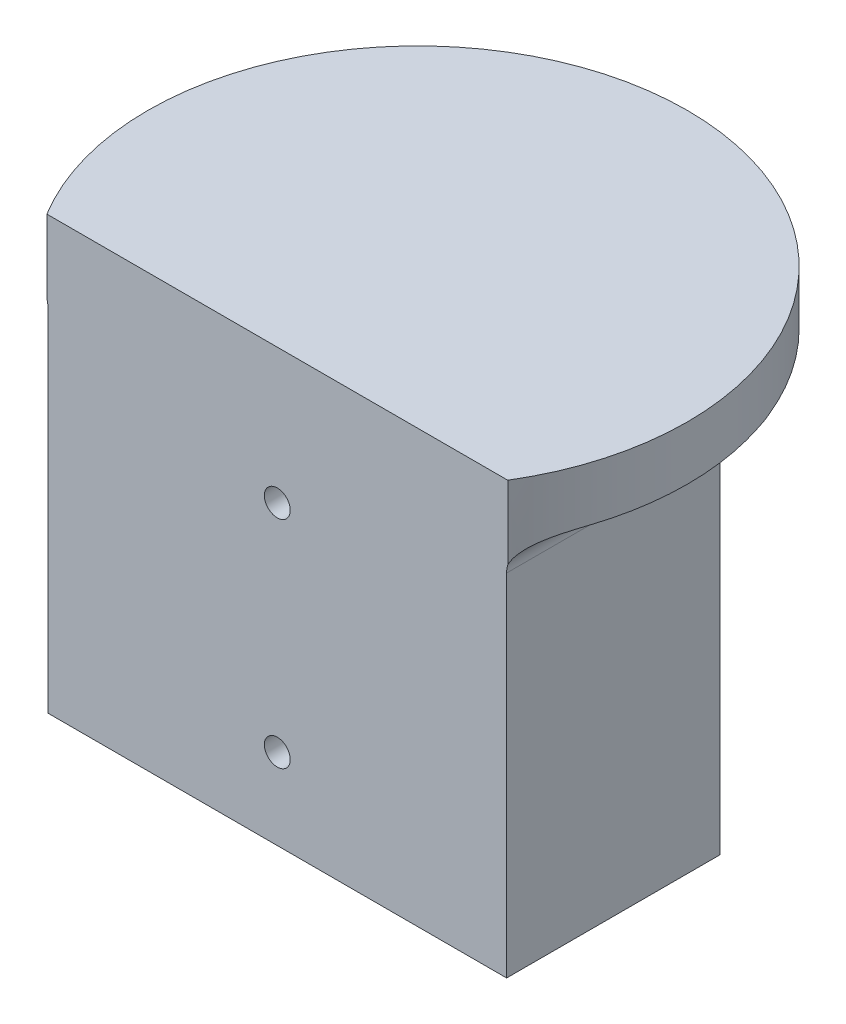
ISO-10303-21;
HEADER;
FILE_DESCRIPTION(('STEP AP214'),'2;1');
FILE_NAME('part.step','',(''),(''),'','','');
FILE_SCHEMA(('AUTOMOTIVE_DESIGN { 1 0 10303 214 1 1 1 1 }'));
ENDSEC;
DATA;
#1=APPLICATION_CONTEXT('core data for automotive mechanical design processes');
#2=APPLICATION_PROTOCOL_DEFINITION('international standard','automotive_design',2000,#1);
#3=PRODUCT_CONTEXT('',#1,'mechanical');
#4=PRODUCT('Part','Part','',(#3));
#5=PRODUCT_RELATED_PRODUCT_CATEGORY('part','',(#4));
#6=PRODUCT_DEFINITION_FORMATION('','',#4);
#7=PRODUCT_DEFINITION_CONTEXT('part definition',#1,'design');
#8=PRODUCT_DEFINITION('design','',#6,#7);
#9=PRODUCT_DEFINITION_SHAPE('','',#8);
#10=(LENGTH_UNIT() NAMED_UNIT(*) SI_UNIT(.MILLI.,.METRE.));
#11=(NAMED_UNIT(*) PLANE_ANGLE_UNIT() SI_UNIT($,.RADIAN.));
#12=(NAMED_UNIT(*) SI_UNIT($,.STERADIAN.) SOLID_ANGLE_UNIT());
#13=UNCERTAINTY_MEASURE_WITH_UNIT(LENGTH_MEASURE(1.E-05),#10,'distance_accuracy_value','');
#14=(GEOMETRIC_REPRESENTATION_CONTEXT(3) GLOBAL_UNCERTAINTY_ASSIGNED_CONTEXT((#13)) GLOBAL_UNIT_ASSIGNED_CONTEXT((#10,
#11,#12)) REPRESENTATION_CONTEXT('',''));
#15=CARTESIAN_POINT('',(0.,0.,0.));
#16=DIRECTION('',(0.,0.,1.));
#17=DIRECTION('',(1.,0.,0.));
#18=AXIS2_PLACEMENT_3D('',#15,#16,#17);
#19=CARTESIAN_POINT('',(0.,70.,0.));
#20=DIRECTION('',(0.,1.,0.));
#21=DIRECTION('',(0.,0.,1.));
#22=AXIS2_PLACEMENT_3D('',#19,#20,#21);
#23=PLANE('',#22);
#24=CARTESIAN_POINT('',(0.,70.,0.));
#25=DIRECTION('',(0.,1.,0.));
#26=DIRECTION('',(0.,0.,1.));
#27=AXIS2_PLACEMENT_3D('',#24,#25,#26);
#28=CIRCLE('',#27,50.);
#29=CARTESIAN_POINT('',(47.5,70.,15.612494995996));
#30=VERTEX_POINT('',#29);
#31=CARTESIAN_POINT('',(47.5,70.,-15.6124949959961));
#32=VERTEX_POINT('',#31);
#33=EDGE_CURVE('E167',#30,#32,#28,.T.);
#34=ORIENTED_EDGE('',*,*,#33,.F.);
#35=DIRECTION('',(0.,0.,-1.));
#36=VECTOR('',#35,1.);
#37=CARTESIAN_POINT('',(47.5,70.,0.));
#38=LINE('',#37,#36);
#39=EDGE_CURVE('E294',#30,#32,#38,.T.);
#40=ORIENTED_EDGE('',*,*,#39,.T.);
#41=EDGE_LOOP('',(#34,#40));
#42=FACE_BOUND('',#41,.T.);
#43=ADVANCED_FACE('F47',(#42),#23,.F.);
#44=CARTESIAN_POINT('',(46.4515877016061,70.,-18.5));
#45=VERTEX_POINT('',#44);
#46=CARTESIAN_POINT('',(-46.4515877016061,70.,-18.5));
#47=VERTEX_POINT('',#46);
#48=EDGE_CURVE('E188',#45,#47,#28,.T.);
#49=ORIENTED_EDGE('',*,*,#48,.F.);
#50=DIRECTION('',(-1.,0.,0.));
#51=VECTOR('',#50,1.);
#52=CARTESIAN_POINT('',(0.,70.,-18.5));
#53=LINE('',#52,#51);
#54=CARTESIAN_POINT('',(27.5,70.,-18.5));
#55=VERTEX_POINT('',#54);
#56=EDGE_CURVE('E291',#45,#55,#53,.T.);
#57=ORIENTED_EDGE('',*,*,#56,.T.);
#58=DIRECTION('',(0.,0.,1.));
#59=VECTOR('',#58,1.);
#60=CARTESIAN_POINT('',(27.5,70.,16.));
#61=LINE('',#60,#59);
#62=CARTESIAN_POINT('',(27.5,70.,11.));
#63=VERTEX_POINT('',#62);
#64=EDGE_CURVE('E288',#55,#63,#61,.T.);
#65=ORIENTED_EDGE('',*,*,#64,.T.);
#66=DIRECTION('',(-1.,0.,0.));
#67=VECTOR('',#66,1.);
#68=CARTESIAN_POINT('',(0.,70.,11.));
#69=LINE('',#68,#67);
#70=CARTESIAN_POINT('',(-27.5,70.,11.));
#71=VERTEX_POINT('',#70);
#72=EDGE_CURVE('E285',#63,#71,#69,.T.);
#73=ORIENTED_EDGE('',*,*,#72,.T.);
#74=DIRECTION('',(0.,0.,-1.));
#75=VECTOR('',#74,1.);
#76=CARTESIAN_POINT('',(-27.5,70.,0.));
#77=LINE('',#76,#75);
#78=CARTESIAN_POINT('',(-27.5,70.,-18.5));
#79=VERTEX_POINT('',#78);
#80=EDGE_CURVE('E282',#71,#79,#77,.T.);
#81=ORIENTED_EDGE('',*,*,#80,.T.);
#82=DIRECTION('',(-1.,0.,0.));
#83=VECTOR('',#82,1.);
#84=CARTESIAN_POINT('',(0.,70.,-18.5));
#85=LINE('',#84,#83);
#86=EDGE_CURVE('E279',#79,#47,#85,.T.);
#87=ORIENTED_EDGE('',*,*,#86,.T.);
#88=EDGE_LOOP('',(#49,#57,#65,#73,#81,#87));
#89=FACE_BOUND('',#88,.T.);
#90=ADVANCED_FACE('F393',(#89),#23,.F.);
#91=CARTESIAN_POINT('',(-32.5,10.,0.));
#92=DIRECTION('',(1.,0.,0.));
#93=DIRECTION('',(0.,0.,-1.));
#94=AXIS2_PLACEMENT_3D('',#91,#92,#93);
#95=PLANE('',#94);
#96=DIRECTION('',(0.,-1.,0.));
#97=VECTOR('',#96,1.);
#98=CARTESIAN_POINT('',(-32.5,10.,-13.5));
#99=LINE('',#98,#97);
#100=CARTESIAN_POINT('',(-32.5,65.,-13.5));
#101=VERTEX_POINT('',#100);
#102=CARTESIAN_POINT('',(-32.5,0.,-13.5));
#103=VERTEX_POINT('',#102);
#104=EDGE_CURVE('E273',#101,#103,#99,.T.);
#105=ORIENTED_EDGE('',*,*,#104,.F.);
#106=DIRECTION('',(0.,0.,-1.));
#107=VECTOR('',#106,1.);
#108=CARTESIAN_POINT('',(-32.5,65.,0.));
#109=LINE('',#108,#107);
#110=CARTESIAN_POINT('',(-32.5,65.,16.));
#111=VERTEX_POINT('',#110);
#112=EDGE_CURVE('E310',#101,#111,#109,.F.);
#113=ORIENTED_EDGE('',*,*,#112,.T.);
#114=DIRECTION('',(0.,-1.,0.));
#115=VECTOR('',#114,1.);
#116=CARTESIAN_POINT('',(-32.5,10.,16.));
#117=LINE('',#116,#115);
#118=CARTESIAN_POINT('',(-32.5,0.,16.));
#119=VERTEX_POINT('',#118);
#120=EDGE_CURVE('E252',#111,#119,#117,.T.);
#121=ORIENTED_EDGE('',*,*,#120,.T.);
#122=DIRECTION('',(0.,0.,1.));
#123=VECTOR('',#122,1.);
#124=CARTESIAN_POINT('',(-32.5,0.,0.));
#125=LINE('',#124,#123);
#126=EDGE_CURVE('E213',#103,#119,#125,.T.);
#127=ORIENTED_EDGE('',*,*,#126,.F.);
#128=EDGE_LOOP('',(#105,#113,#121,#127));
#129=FACE_BOUND('',#128,.T.);
#130=ADVANCED_FACE('F400',(#129),#95,.T.);
#131=CARTESIAN_POINT('',(0.,10.,-13.5));
#132=DIRECTION('',(0.,0.,-1.));
#133=DIRECTION('',(-1.,0.,0.));
#134=AXIS2_PLACEMENT_3D('',#131,#132,#133);
#135=PLANE('',#134);
#136=DIRECTION('',(0.,-1.,0.));
#137=VECTOR('',#136,1.);
#138=CARTESIAN_POINT('',(-42.5,10.,-13.5));
#139=LINE('',#138,#137);
#140=CARTESIAN_POINT('',(-42.5,65.,-13.5));
#141=VERTEX_POINT('',#140);
#142=CARTESIAN_POINT('',(-42.5,0.,-13.5));
#143=VERTEX_POINT('',#142);
#144=EDGE_CURVE('E270',#141,#143,#139,.T.);
#145=ORIENTED_EDGE('',*,*,#144,.F.);
#146=DIRECTION('',(-1.,0.,0.));
#147=VECTOR('',#146,1.);
#148=CARTESIAN_POINT('',(0.,65.,-13.5));
#149=LINE('',#148,#147);
#150=EDGE_CURVE('E313',#141,#101,#149,.F.);
#151=ORIENTED_EDGE('',*,*,#150,.T.);
#152=ORIENTED_EDGE('',*,*,#104,.T.);
#153=DIRECTION('',(1.,0.,0.));
#154=VECTOR('',#153,1.);
#155=CARTESIAN_POINT('',(0.,0.,-13.5));
#156=LINE('',#155,#154);
#157=EDGE_CURVE('E217',#143,#103,#156,.T.);
#158=ORIENTED_EDGE('',*,*,#157,.F.);
#159=EDGE_LOOP('',(#145,#151,#152,#158));
#160=FACE_BOUND('',#159,.T.);
#161=ADVANCED_FACE('F463',(#160),#135,.T.);
#162=CARTESIAN_POINT('',(-42.5,10.,0.));
#163=DIRECTION('',(1.,0.,0.));
#164=DIRECTION('',(0.,0.,-1.));
#165=AXIS2_PLACEMENT_3D('',#162,#163,#164);
#166=PLANE('',#165);
#167=DIRECTION('',(0.,-1.,0.));
#168=VECTOR('',#167,1.);
#169=CARTESIAN_POINT('',(-42.5,10.,26.));
#170=LINE('',#169,#168);
#171=CARTESIAN_POINT('',(-42.5,65.,26.));
#172=VERTEX_POINT('',#171);
#173=CARTESIAN_POINT('',(-42.5,0.,26.));
#174=VERTEX_POINT('',#173);
#175=EDGE_CURVE('E267',#172,#174,#170,.T.);
#176=ORIENTED_EDGE('',*,*,#175,.F.);
#177=DIRECTION('',(0.,0.,1.));
#178=VECTOR('',#177,1.);
#179=CARTESIAN_POINT('',(-42.5,65.,-13.5));
#180=LINE('',#179,#178);
#181=EDGE_CURVE('E316',#172,#141,#180,.F.);
#182=ORIENTED_EDGE('',*,*,#181,.T.);
#183=ORIENTED_EDGE('',*,*,#144,.T.);
#184=DIRECTION('',(0.,0.,1.));
#185=VECTOR('',#184,1.);
#186=CARTESIAN_POINT('',(-42.5,0.,0.));
#187=LINE('',#186,#185);
#188=EDGE_CURVE('E221',#143,#174,#187,.T.);
#189=ORIENTED_EDGE('',*,*,#188,.T.);
#190=EDGE_LOOP('',(#176,#182,#183,#189));
#191=FACE_BOUND('',#190,.T.);
#192=ADVANCED_FACE('F459',(#191),#166,.F.);
#193=CARTESIAN_POINT('',(0.,10.,26.));
#194=DIRECTION('',(0.,0.,-1.));
#195=DIRECTION('',(-1.,0.,0.));
#196=AXIS2_PLACEMENT_3D('',#193,#194,#195);
#197=PLANE('',#196);
#198=CARTESIAN_POINT('',(0.,55.,26.));
#199=DIRECTION('',(0.,0.,-1.));
#200=DIRECTION('',(-1.,0.,0.));
#201=AXIS2_PLACEMENT_3D('',#198,#199,#200);
#202=CIRCLE('',#201,2.4);
#203=CARTESIAN_POINT('',(-2.4,55.,26.));
#204=VERTEX_POINT('',#203);
#205=EDGE_CURVE('E808',#204,#204,#202,.T.);
#206=ORIENTED_EDGE('',*,*,#205,.T.);
#207=EDGE_LOOP('',(#206));
#208=FACE_BOUND('',#207,.T.);
#209=CARTESIAN_POINT('',(0.,15.,26.));
#210=DIRECTION('',(0.,0.,-1.));
#211=DIRECTION('',(-1.,0.,0.));
#212=AXIS2_PLACEMENT_3D('',#209,#210,#211);
#213=CIRCLE('',#212,2.4);
#214=CARTESIAN_POINT('',(-2.4,15.,26.));
#215=VERTEX_POINT('',#214);
#216=EDGE_CURVE('E437',#215,#215,#213,.T.);
#217=ORIENTED_EDGE('',*,*,#216,.T.);
#218=EDGE_LOOP('',(#217));
#219=FACE_BOUND('',#218,.T.);
#220=DIRECTION('',(1.,0.,0.));
#221=VECTOR('',#220,1.);
#222=CARTESIAN_POINT('',(0.,0.,26.));
#223=LINE('',#222,#221);
#224=CARTESIAN_POINT('',(42.5,0.,26.));
#225=VERTEX_POINT('',#224);
#226=EDGE_CURVE('E225',#174,#225,#223,.T.);
#227=ORIENTED_EDGE('',*,*,#226,.T.);
#228=DIRECTION('',(0.,-1.,0.));
#229=VECTOR('',#228,1.);
#230=CARTESIAN_POINT('',(42.5,10.,26.));
#231=LINE('',#230,#229);
#232=CARTESIAN_POINT('',(42.5,65.,26.));
#233=VERTEX_POINT('',#232);
#234=EDGE_CURVE('E264',#233,#225,#231,.T.);
#235=ORIENTED_EDGE('',*,*,#234,.F.);
#236=CARTESIAN_POINT('',(47.5,65.,26.));
#237=DIRECTION('',(0.,0.,-1.));
#238=DIRECTION('',(-1.,0.,0.));
#239=AXIS2_PLACEMENT_3D('',#236,#237,#238);
#240=CIRCLE('',#239,5.);
#241=CARTESIAN_POINT('',(42.7083130081252,66.428193184376,26.));
#242=VERTEX_POINT('',#241);
#243=EDGE_CURVE('E173',#233,#242,#240,.T.);
#244=ORIENTED_EDGE('',*,*,#243,.T.);
#245=DIRECTION('',(0.,-1.,0.));
#246=VECTOR('',#245,1.);
#247=CARTESIAN_POINT('',(42.7083130081252,80.,26.));
#248=LINE('',#247,#246);
#249=CARTESIAN_POINT('',(42.7083130081252,80.,26.));
#250=VERTEX_POINT('',#249);
#251=EDGE_CURVE('E74',#250,#242,#248,.T.);
#252=ORIENTED_EDGE('',*,*,#251,.F.);
#253=DIRECTION('',(1.,0.,0.));
#254=VECTOR('',#253,1.);
#255=CARTESIAN_POINT('',(-42.5,80.,26.));
#256=LINE('',#255,#254);
#257=CARTESIAN_POINT('',(-42.7083130081252,80.,26.));
#258=VERTEX_POINT('',#257);
#259=EDGE_CURVE('E163',#258,#250,#256,.T.);
#260=ORIENTED_EDGE('',*,*,#259,.F.);
#261=DIRECTION('',(0.,-1.,0.));
#262=VECTOR('',#261,1.);
#263=CARTESIAN_POINT('',(-42.7083130081252,80.,26.));
#264=LINE('',#263,#262);
#265=CARTESIAN_POINT('',(-42.7083130081252,66.4281931843761,26.));
#266=VERTEX_POINT('',#265);
#267=EDGE_CURVE('E66',#258,#266,#264,.T.);
#268=ORIENTED_EDGE('',*,*,#267,.T.);
#269=CARTESIAN_POINT('',(-47.5,65.,26.));
#270=DIRECTION('',(0.,0.,-1.));
#271=DIRECTION('',(-1.,0.,0.));
#272=AXIS2_PLACEMENT_3D('',#269,#270,#271);
#273=CIRCLE('',#272,5.);
#274=EDGE_CURVE('E58',#266,#172,#273,.T.);
#275=ORIENTED_EDGE('',*,*,#274,.T.);
#276=ORIENTED_EDGE('',*,*,#175,.T.);
#277=EDGE_LOOP('',(#227,#235,#244,#252,#260,#268,#275,#276));
#278=FACE_BOUND('',#277,.T.);
#279=ADVANCED_FACE('F170',(#208,#219,#278),#197,.F.);
#280=CARTESIAN_POINT('',(42.5,10.,0.));
#281=DIRECTION('',(1.,0.,0.));
#282=DIRECTION('',(0.,0.,-1.));
#283=AXIS2_PLACEMENT_3D('',#280,#281,#282);
#284=PLANE('',#283);
#285=DIRECTION('',(0.,-1.,0.));
#286=VECTOR('',#285,1.);
#287=CARTESIAN_POINT('',(42.5,10.,-13.5));
#288=LINE('',#287,#286);
#289=CARTESIAN_POINT('',(42.5,65.,-13.5));
#290=VERTEX_POINT('',#289);
#291=CARTESIAN_POINT('',(42.5,0.,-13.5));
#292=VERTEX_POINT('',#291);
#293=EDGE_CURVE('E261',#290,#292,#288,.T.);
#294=ORIENTED_EDGE('',*,*,#293,.F.);
#295=DIRECTION('',(0.,0.,-1.));
#296=VECTOR('',#295,1.);
#297=CARTESIAN_POINT('',(42.5,65.,0.));
#298=LINE('',#297,#296);
#299=EDGE_CURVE('E298',#290,#233,#298,.F.);
#300=ORIENTED_EDGE('',*,*,#299,.T.);
#301=ORIENTED_EDGE('',*,*,#234,.T.);
#302=DIRECTION('',(0.,0.,1.));
#303=VECTOR('',#302,1.);
#304=CARTESIAN_POINT('',(42.5,0.,0.));
#305=LINE('',#304,#303);
#306=EDGE_CURVE('E228',#292,#225,#305,.T.);
#307=ORIENTED_EDGE('',*,*,#306,.F.);
#308=EDGE_LOOP('',(#294,#300,#301,#307));
#309=FACE_BOUND('',#308,.T.);
#310=ADVANCED_FACE('F504',(#309),#284,.T.);
#311=CARTESIAN_POINT('',(0.,10.,-13.5));
#312=DIRECTION('',(0.,0.,-1.));
#313=DIRECTION('',(-1.,0.,0.));
#314=AXIS2_PLACEMENT_3D('',#311,#312,#313);
#315=PLANE('',#314);
#316=DIRECTION('',(0.,-1.,0.));
#317=VECTOR('',#316,1.);
#318=CARTESIAN_POINT('',(32.5,10.,-13.5));
#319=LINE('',#318,#317);
#320=CARTESIAN_POINT('',(32.5,65.,-13.5));
#321=VERTEX_POINT('',#320);
#322=CARTESIAN_POINT('',(32.5,0.,-13.5));
#323=VERTEX_POINT('',#322);
#324=EDGE_CURVE('E258',#321,#323,#319,.T.);
#325=ORIENTED_EDGE('',*,*,#324,.F.);
#326=DIRECTION('',(-1.,0.,0.));
#327=VECTOR('',#326,1.);
#328=CARTESIAN_POINT('',(0.,65.,-13.5));
#329=LINE('',#328,#327);
#330=EDGE_CURVE('E301',#321,#290,#329,.F.);
#331=ORIENTED_EDGE('',*,*,#330,.T.);
#332=ORIENTED_EDGE('',*,*,#293,.T.);
#333=DIRECTION('',(1.,0.,0.));
#334=VECTOR('',#333,1.);
#335=CARTESIAN_POINT('',(0.,0.,-13.5));
#336=LINE('',#335,#334);
#337=EDGE_CURVE('E232',#323,#292,#336,.T.);
#338=ORIENTED_EDGE('',*,*,#337,.F.);
#339=EDGE_LOOP('',(#325,#331,#332,#338));
#340=FACE_BOUND('',#339,.T.);
#341=ADVANCED_FACE('F502',(#340),#315,.T.);
#342=CARTESIAN_POINT('',(32.5,10.,0.));
#343=DIRECTION('',(1.,0.,0.));
#344=DIRECTION('',(0.,0.,-1.));
#345=AXIS2_PLACEMENT_3D('',#342,#343,#344);
#346=PLANE('',#345);
#347=DIRECTION('',(0.,-1.,0.));
#348=VECTOR('',#347,1.);
#349=CARTESIAN_POINT('',(32.5,10.,16.));
#350=LINE('',#349,#348);
#351=CARTESIAN_POINT('',(32.5,65.,16.));
#352=VERTEX_POINT('',#351);
#353=CARTESIAN_POINT('',(32.5,0.,16.));
#354=VERTEX_POINT('',#353);
#355=EDGE_CURVE('E255',#352,#354,#350,.T.);
#356=ORIENTED_EDGE('',*,*,#355,.F.);
#357=DIRECTION('',(0.,0.,1.));
#358=VECTOR('',#357,1.);
#359=CARTESIAN_POINT('',(32.5,65.,-13.5));
#360=LINE('',#359,#358);
#361=EDGE_CURVE('E304',#352,#321,#360,.F.);
#362=ORIENTED_EDGE('',*,*,#361,.T.);
#363=ORIENTED_EDGE('',*,*,#324,.T.);
#364=DIRECTION('',(0.,0.,1.));
#365=VECTOR('',#364,1.);
#366=CARTESIAN_POINT('',(32.5,0.,0.));
#367=LINE('',#366,#365);
#368=EDGE_CURVE('E236',#323,#354,#367,.T.);
#369=ORIENTED_EDGE('',*,*,#368,.T.);
#370=EDGE_LOOP('',(#356,#362,#363,#369));
#371=FACE_BOUND('',#370,.T.);
#372=ADVANCED_FACE('F511',(#371),#346,.F.);
#373=CARTESIAN_POINT('',(37.5,10.,8.5));
#374=DIRECTION('',(0.,-1.,0.));
#375=DIRECTION('',(0.,0.,-1.));
#376=AXIS2_PLACEMENT_3D('',#373,#374,#375);
#377=CYLINDRICAL_SURFACE('',#376,2.75);
#378=CARTESIAN_POINT('',(37.5,10.,8.5));
#379=DIRECTION('',(0.,1.,0.));
#380=DIRECTION('',(0.,0.,1.));
#381=AXIS2_PLACEMENT_3D('',#378,#379,#380);
#382=CIRCLE('',#381,2.75);
#383=CARTESIAN_POINT('',(37.5,10.,11.25));
#384=VERTEX_POINT('',#383);
#385=EDGE_CURVE('E199',#384,#384,#382,.T.);
#386=ORIENTED_EDGE('',*,*,#385,.T.);
#387=EDGE_LOOP('',(#386));
#388=FACE_BOUND('',#387,.T.);
#389=CARTESIAN_POINT('',(37.5,0.,8.5));
#390=DIRECTION('',(0.,1.,0.));
#391=DIRECTION('',(0.,0.,1.));
#392=AXIS2_PLACEMENT_3D('',#389,#390,#391);
#393=CIRCLE('',#392,2.75);
#394=CARTESIAN_POINT('',(37.5,0.,11.25));
#395=VERTEX_POINT('',#394);
#396=EDGE_CURVE('E244',#395,#395,#393,.T.);
#397=ORIENTED_EDGE('',*,*,#396,.F.);
#398=EDGE_LOOP('',(#397));
#399=FACE_BOUND('',#398,.T.);
#400=ADVANCED_FACE('F532',(#388,#399),#377,.F.);
#401=CARTESIAN_POINT('',(0.,10.,16.));
#402=DIRECTION('',(0.,0.,-1.));
#403=DIRECTION('',(-1.,0.,0.));
#404=AXIS2_PLACEMENT_3D('',#401,#402,#403);
#405=PLANE('',#404);
#406=CARTESIAN_POINT('',(0.,55.,16.));
#407=DIRECTION('',(0.,0.,-1.));
#408=DIRECTION('',(-1.,0.,0.));
#409=AXIS2_PLACEMENT_3D('',#406,#407,#408);
#410=CIRCLE('',#409,3.99999999999999);
#411=CARTESIAN_POINT('',(-3.99999999999999,55.,16.));
#412=VERTEX_POINT('',#411);
#413=EDGE_CURVE('E798',#412,#412,#410,.T.);
#414=ORIENTED_EDGE('',*,*,#413,.F.);
#415=EDGE_LOOP('',(#414));
#416=FACE_BOUND('',#415,.T.);
#417=CARTESIAN_POINT('',(0.,15.,16.));
#418=DIRECTION('',(0.,0.,-1.));
#419=DIRECTION('',(-1.,0.,0.));
#420=AXIS2_PLACEMENT_3D('',#417,#418,#419);
#421=CIRCLE('',#420,3.99999999999999);
#422=CARTESIAN_POINT('',(-3.99999999999999,15.,16.));
#423=VERTEX_POINT('',#422);
#424=EDGE_CURVE('E812',#423,#423,#421,.T.);
#425=ORIENTED_EDGE('',*,*,#424,.F.);
#426=EDGE_LOOP('',(#425));
#427=FACE_BOUND('',#426,.T.);
#428=ORIENTED_EDGE('',*,*,#120,.F.);
#429=DIRECTION('',(-1.,0.,0.));
#430=VECTOR('',#429,1.);
#431=CARTESIAN_POINT('',(0.,65.,16.));
#432=LINE('',#431,#430);
#433=EDGE_CURVE('E307',#111,#352,#432,.F.);
#434=ORIENTED_EDGE('',*,*,#433,.T.);
#435=ORIENTED_EDGE('',*,*,#355,.T.);
#436=DIRECTION('',(1.,0.,0.));
#437=VECTOR('',#436,1.);
#438=CARTESIAN_POINT('',(0.,0.,16.));
#439=LINE('',#438,#437);
#440=EDGE_CURVE('E240',#119,#354,#439,.T.);
#441=ORIENTED_EDGE('',*,*,#440,.F.);
#442=EDGE_LOOP('',(#428,#434,#435,#441));
#443=FACE_BOUND('',#442,.T.);
#444=ADVANCED_FACE('F495',(#416,#427,#443),#405,.T.);
#445=CARTESIAN_POINT('',(-37.5,10.,-8.5));
#446=DIRECTION('',(0.,-1.,0.));
#447=DIRECTION('',(0.,0.,-1.));
#448=AXIS2_PLACEMENT_3D('',#445,#446,#447);
#449=CYLINDRICAL_SURFACE('',#448,2.75);
#450=CARTESIAN_POINT('',(-37.5,10.,-8.5));
#451=DIRECTION('',(0.,1.,0.));
#452=DIRECTION('',(0.,0.,1.));
#453=AXIS2_PLACEMENT_3D('',#450,#451,#452);
#454=CIRCLE('',#453,2.75);
#455=CARTESIAN_POINT('',(-37.5,10.,-5.75));
#456=VERTEX_POINT('',#455);
#457=EDGE_CURVE('E195',#456,#456,#454,.T.);
#458=ORIENTED_EDGE('',*,*,#457,.T.);
#459=EDGE_LOOP('',(#458));
#460=FACE_BOUND('',#459,.T.);
#461=CARTESIAN_POINT('',(-37.5,0.,-8.5));
#462=DIRECTION('',(0.,1.,0.));
#463=DIRECTION('',(0.,0.,1.));
#464=AXIS2_PLACEMENT_3D('',#461,#462,#463);
#465=CIRCLE('',#464,2.75);
#466=CARTESIAN_POINT('',(-37.5,0.,-5.75));
#467=VERTEX_POINT('',#466);
#468=EDGE_CURVE('E209',#467,#467,#465,.T.);
#469=ORIENTED_EDGE('',*,*,#468,.F.);
#470=EDGE_LOOP('',(#469));
#471=FACE_BOUND('',#470,.T.);
#472=ADVANCED_FACE('F522',(#460,#471),#449,.F.);
#473=CARTESIAN_POINT('',(-37.5,10.,8.5));
#474=DIRECTION('',(0.,-1.,0.));
#475=DIRECTION('',(0.,0.,-1.));
#476=AXIS2_PLACEMENT_3D('',#473,#474,#475);
#477=CYLINDRICAL_SURFACE('',#476,2.75);
#478=CARTESIAN_POINT('',(-37.5,10.,8.5));
#479=DIRECTION('',(0.,1.,0.));
#480=DIRECTION('',(0.,0.,1.));
#481=AXIS2_PLACEMENT_3D('',#478,#479,#480);
#482=CIRCLE('',#481,2.75);
#483=CARTESIAN_POINT('',(-37.5,10.,11.25));
#484=VERTEX_POINT('',#483);
#485=EDGE_CURVE('E190',#484,#484,#482,.T.);
#486=ORIENTED_EDGE('',*,*,#485,.T.);
#487=EDGE_LOOP('',(#486));
#488=FACE_BOUND('',#487,.T.);
#489=CARTESIAN_POINT('',(-37.5,0.,8.5));
#490=DIRECTION('',(0.,1.,0.));
#491=DIRECTION('',(0.,0.,1.));
#492=AXIS2_PLACEMENT_3D('',#489,#490,#491);
#493=CIRCLE('',#492,2.75);
#494=CARTESIAN_POINT('',(-37.5,0.,11.25));
#495=VERTEX_POINT('',#494);
#496=EDGE_CURVE('E194',#495,#495,#493,.T.);
#497=ORIENTED_EDGE('',*,*,#496,.F.);
#498=EDGE_LOOP('',(#497));
#499=FACE_BOUND('',#498,.T.);
#500=ADVANCED_FACE('F340',(#488,#499),#477,.F.);
#501=CARTESIAN_POINT('',(37.5,10.,-8.5));
#502=DIRECTION('',(0.,-1.,0.));
#503=DIRECTION('',(0.,0.,-1.));
#504=AXIS2_PLACEMENT_3D('',#501,#502,#503);
#505=CYLINDRICAL_SURFACE('',#504,2.75);
#506=CARTESIAN_POINT('',(37.5,10.,-8.5));
#507=DIRECTION('',(0.,1.,0.));
#508=DIRECTION('',(0.,0.,1.));
#509=AXIS2_PLACEMENT_3D('',#506,#507,#508);
#510=CIRCLE('',#509,2.75);
#511=CARTESIAN_POINT('',(37.5,10.,-5.75));
#512=VERTEX_POINT('',#511);
#513=EDGE_CURVE('E176',#512,#512,#510,.T.);
#514=ORIENTED_EDGE('',*,*,#513,.T.);
#515=EDGE_LOOP('',(#514));
#516=FACE_BOUND('',#515,.T.);
#517=CARTESIAN_POINT('',(37.5,0.,-8.5));
#518=DIRECTION('',(0.,1.,0.));
#519=DIRECTION('',(0.,0.,1.));
#520=AXIS2_PLACEMENT_3D('',#517,#518,#519);
#521=CIRCLE('',#520,2.75);
#522=CARTESIAN_POINT('',(37.5,0.,-5.75));
#523=VERTEX_POINT('',#522);
#524=EDGE_CURVE('E248',#523,#523,#521,.T.);
#525=ORIENTED_EDGE('',*,*,#524,.F.);
#526=EDGE_LOOP('',(#525));
#527=FACE_BOUND('',#526,.T.);
#528=ADVANCED_FACE('F529',(#516,#527),#505,.F.);
#529=CARTESIAN_POINT('',(0.,0.,0.));
#530=DIRECTION('',(0.,1.,0.));
#531=DIRECTION('',(0.,0.,1.));
#532=AXIS2_PLACEMENT_3D('',#529,#530,#531);
#533=PLANE('',#532);
#534=ORIENTED_EDGE('',*,*,#496,.T.);
#535=EDGE_LOOP('',(#534));
#536=FACE_BOUND('',#535,.T.);
#537=ORIENTED_EDGE('',*,*,#468,.T.);
#538=EDGE_LOOP('',(#537));
#539=FACE_BOUND('',#538,.T.);
#540=ORIENTED_EDGE('',*,*,#126,.T.);
#541=ORIENTED_EDGE('',*,*,#440,.T.);
#542=ORIENTED_EDGE('',*,*,#368,.F.);
#543=ORIENTED_EDGE('',*,*,#337,.T.);
#544=ORIENTED_EDGE('',*,*,#306,.T.);
#545=ORIENTED_EDGE('',*,*,#226,.F.);
#546=ORIENTED_EDGE('',*,*,#188,.F.);
#547=ORIENTED_EDGE('',*,*,#157,.T.);
#548=EDGE_LOOP('',(#540,#541,#542,#543,#544,#545,#546,#547));
#549=FACE_BOUND('',#548,.T.);
#550=ORIENTED_EDGE('',*,*,#396,.T.);
#551=EDGE_LOOP('',(#550));
#552=FACE_BOUND('',#551,.T.);
#553=ORIENTED_EDGE('',*,*,#524,.T.);
#554=EDGE_LOOP('',(#553));
#555=FACE_BOUND('',#554,.T.);
#556=ADVANCED_FACE('F467',(#536,#539,#549,#552,#555),#533,.F.);
#557=CARTESIAN_POINT('',(0.,10.,0.));
#558=DIRECTION('',(0.,-1.,0.));
#559=DIRECTION('',(0.,0.,-1.));
#560=AXIS2_PLACEMENT_3D('',#557,#558,#559);
#561=PLANE('',#560);
#562=ORIENTED_EDGE('',*,*,#513,.F.);
#563=EDGE_LOOP('',(#562));
#564=FACE_BOUND('',#563,.T.);
#565=ADVANCED_FACE('F414',(#564),#561,.T.);
#566=ORIENTED_EDGE('',*,*,#385,.F.);
#567=EDGE_LOOP('',(#566));
#568=FACE_BOUND('',#567,.T.);
#569=ADVANCED_FACE('F546',(#568),#561,.T.);
#570=ORIENTED_EDGE('',*,*,#457,.F.);
#571=EDGE_LOOP('',(#570));
#572=FACE_BOUND('',#571,.T.);
#573=ADVANCED_FACE('F412',(#572),#561,.T.);
#574=ORIENTED_EDGE('',*,*,#485,.F.);
#575=EDGE_LOOP('',(#574));
#576=FACE_BOUND('',#575,.T.);
#577=ADVANCED_FACE('F405',(#576),#561,.T.);
#578=CARTESIAN_POINT('',(-47.5,70.,-15.612494995996));
#579=VERTEX_POINT('',#578);
#580=CARTESIAN_POINT('',(-47.5,70.,15.6124949959961));
#581=VERTEX_POINT('',#580);
#582=EDGE_CURVE('E185',#579,#581,#28,.T.);
#583=ORIENTED_EDGE('',*,*,#582,.F.);
#584=DIRECTION('',(0.,0.,1.));
#585=VECTOR('',#584,1.);
#586=CARTESIAN_POINT('',(-47.5,70.,26.));
#587=LINE('',#586,#585);
#588=EDGE_CURVE('E276',#579,#581,#587,.T.);
#589=ORIENTED_EDGE('',*,*,#588,.T.);
#590=EDGE_LOOP('',(#583,#589));
#591=FACE_BOUND('',#590,.T.);
#592=ADVANCED_FACE('F395',(#591),#23,.F.);
#593=CARTESIAN_POINT('',(0.,80.,0.));
#594=DIRECTION('',(0.,-1.,0.));
#595=DIRECTION('',(0.,0.,-1.));
#596=AXIS2_PLACEMENT_3D('',#593,#594,#595);
#597=CYLINDRICAL_SURFACE('',#596,50.);
#598=ORIENTED_EDGE('',*,*,#251,.T.);
#599=CARTESIAN_POINT('',(42.7083130081252,66.428193184376,26.));
#600=CARTESIAN_POINT('',(42.7453276599463,66.552337003613,25.9392072630419));
#601=CARTESIAN_POINT('',(42.7861727334251,66.6718005802572,25.8718148658703));
#602=CARTESIAN_POINT('',(42.8738562947973,66.9010053609691,25.7262415711702));
#603=CARTESIAN_POINT('',(42.9206732017241,67.0107792765627,25.6480994448412));
#604=CARTESIAN_POINT('',(43.0181075211547,67.2193872278066,25.4843361433579));
#605=CARTESIAN_POINT('',(43.0686498476198,67.3183713806687,25.398858953859));
#606=CARTESIAN_POINT('',(43.1731404935329,67.5079899378857,25.2208368056018));
#607=CARTESIAN_POINT('',(43.2270924245179,67.5986152297911,25.1282843300197));
#608=CARTESIAN_POINT('',(43.3632660592848,67.8125080964168,24.8928355463721));
#609=CARTESIAN_POINT('',(43.4469114401531,67.9312270768098,24.7466329038158));
#610=CARTESIAN_POINT('',(43.6173588604968,68.1535238751572,24.4449602505128));
#611=CARTESIAN_POINT('',(43.7041616791917,68.2570979234206,24.289487945986));
#612=CARTESIAN_POINT('',(43.8802019906363,68.451727532424,23.9700110475851));
#613=CARTESIAN_POINT('',(43.9694540750364,68.5426666505868,23.8059441158208));
#614=CARTESIAN_POINT('',(44.1486096243311,68.7126040373809,23.4720301417327));
#615=CARTESIAN_POINT('',(44.2385133460697,68.7915972954852,23.30218071041));
#616=CARTESIAN_POINT('',(44.4156666185585,68.9369587628143,22.9626699121247));
#617=CARTESIAN_POINT('',(44.5029206909565,69.0036161342118,22.7931337255828));
#618=CARTESIAN_POINT('',(44.6767338301576,69.1280244448999,22.4505312397315));
#619=CARTESIAN_POINT('',(44.7632929977033,69.1857766981333,22.2774654654849));
#620=CARTESIAN_POINT('',(44.9354100007737,69.2933889512788,21.9282205988345));
#621=CARTESIAN_POINT('',(45.0209669050088,69.3432420785999,21.7520389419943));
#622=CARTESIAN_POINT('',(45.1907132453234,69.4358235331099,21.3971529908911));
#623=CARTESIAN_POINT('',(45.2749025156951,69.4785510026529,21.2184483957703));
#624=CARTESIAN_POINT('',(45.5250697330135,69.5971506744132,20.6790953012261));
#625=CARTESIAN_POINT('',(45.6886480045773,69.6634406945896,20.3152056315533));
#626=CARTESIAN_POINT('',(46.0080206282916,69.7752033775378,19.5811721684102));
#627=CARTESIAN_POINT('',(46.1638180544228,69.8206843202508,19.2110309233407));
#628=CARTESIAN_POINT('',(46.4233765475511,69.8839746361707,18.572891030891));
#629=CARTESIAN_POINT('',(46.5292151899039,69.90598051284,18.3061363400032));
#630=CARTESIAN_POINT('',(46.736448614047,69.942475100054,17.7703928058043));
#631=CARTESIAN_POINT('',(46.8378433009332,69.9569636501319,17.5014039149261));
#632=CARTESIAN_POINT('',(47.0353652685504,69.9793506284138,16.9633711018812));
#633=CARTESIAN_POINT('',(47.1315243750859,69.9872943486186,16.6943406683864));
#634=CARTESIAN_POINT('',(47.3192335599291,69.9976109173422,16.1546216514026));
#635=CARTESIAN_POINT('',(47.4107844610008,69.9999847638015,15.8839333736604));
#636=CARTESIAN_POINT('',(47.5,70.,15.612494995996));
#637=B_SPLINE_CURVE_WITH_KNOTS('',3,(#599,#600,#601,#602,#603,#604,#605,#606,#607,#608,#609,
#610,#611,#612,#613,#614,#615,#616,#617,#618,#619,#620,#621,#622,#623,#624,#625,#626,#627,#628,
#629,#630,#631,#632,#633,#634,#635,#636),.UNSPECIFIED.,.F.,.F.,(4,2,2,2,2,2,2,2,2,2,2,2,2,2,2,2,
2,2,4),(0.,0.428637570106054,0.855767833193602,1.27587988628615,1.69644464319424,
2.31364068042877,2.93099008197758,3.55369715300204,4.17666468983136,4.78237156558176,
5.38798898408962,5.99413045718307,6.60034483304458,7.81276715490216,9.02470663292793,
9.88804425102488,10.75140029739,11.6087302755874,12.4659066363625),.UNSPECIFIED.);
#638=EDGE_CURVE('E345',#242,#30,#637,.T.);
#639=ORIENTED_EDGE('',*,*,#638,.T.);
#640=ORIENTED_EDGE('',*,*,#33,.T.);
#641=CARTESIAN_POINT('',(47.5,70.,-15.6124949959961));
#642=CARTESIAN_POINT('',(47.4410937961274,69.9999975534666,-15.791714164982));
#643=CARTESIAN_POINT('',(47.3811718879444,69.9989589653632,-15.9706024385147));
#644=CARTESIAN_POINT('',(47.2593352358211,69.9945771890098,-16.3276082141503));
#645=CARTESIAN_POINT('',(47.1974211162615,69.9912347162431,-16.5057259382754));
#646=CARTESIAN_POINT('',(47.071601467424,69.9820131006348,-16.8611945237116));
#647=CARTESIAN_POINT('',(47.0076959206947,69.9761339355577,-17.038545378287));
#648=CARTESIAN_POINT('',(46.8779016170162,69.9615774283149,-17.3924664424284));
#649=CARTESIAN_POINT('',(46.8120122503177,69.9528992177044,-17.5690363924492));
#650=CARTESIAN_POINT('',(46.7451546747725,69.94269243783,-17.7451546747725));
#651=B_SPLINE_CURVE_WITH_KNOTS('',3,(#641,#642,#643,#644,#645,#646,#647,#648,#649,#650),
.UNSPECIFIED.,.F.,.F.,(4,2,2,2,4),(0.,0.565953191316879,1.13173070208598,1.69751317229983,
2.26347135396444),.UNSPECIFIED.);
#652=CARTESIAN_POINT('',(46.7451546747725,69.94269243783,-17.7451546747725));
#653=VERTEX_POINT('',#652);
#654=EDGE_CURVE('E319',#32,#653,#651,.T.);
#655=ORIENTED_EDGE('',*,*,#654,.T.);
#656=CARTESIAN_POINT('',(46.7451546747725,69.94269243783,-17.7451546747725));
#657=CARTESIAN_POINT('',(46.7213464516121,69.9522710961524,-17.8078726864654));
#658=CARTESIAN_POINT('',(46.6973515048796,69.960644173376,-17.8707000140227));
#659=CARTESIAN_POINT('',(46.6490463541588,69.9749772841138,-17.9964159390476));
#660=CARTESIAN_POINT('',(46.6247365897225,69.9809403717006,-18.0593043570898));
#661=CARTESIAN_POINT('',(46.551307421463,69.9952482496955,-18.2481250799611));
#662=CARTESIAN_POINT('',(46.5017108028239,70.0000025751772,-18.3741531509436));
#663=CARTESIAN_POINT('',(46.4515877016061,70.,-18.5));
#664=B_SPLINE_CURVE_WITH_KNOTS('',3,(#656,#657,#658,#659,#660,#661,#662,#663),.UNSPECIFIED.,.F.,
.F.,(4,2,2,4),(0.,0.203277810323842,0.406297201840154,0.812529013288369),.UNSPECIFIED.);
#665=EDGE_CURVE('E352',#653,#45,#664,.T.);
#666=ORIENTED_EDGE('',*,*,#665,.T.);
#667=ORIENTED_EDGE('',*,*,#48,.T.);
#668=CARTESIAN_POINT('',(-46.4515877016061,70.,-18.5));
#669=CARTESIAN_POINT('',(-46.5017108028239,70.0000025751772,-18.3741531509436));
#670=CARTESIAN_POINT('',(-46.551307421463,69.9952482496955,-18.2481250799611));
#671=CARTESIAN_POINT('',(-46.6247365897225,69.9809403717006,-18.0593043570898));
#672=CARTESIAN_POINT('',(-46.6490463541588,69.9749772841138,-17.9964159390476));
#673=CARTESIAN_POINT('',(-46.6973515048795,69.960644173376,-17.8707000140227));
#674=CARTESIAN_POINT('',(-46.7213464516121,69.9522710961524,-17.8078726864654));
#675=CARTESIAN_POINT('',(-46.7451546747725,69.94269243783,-17.7451546747725));
#676=B_SPLINE_CURVE_WITH_KNOTS('',3,(#668,#669,#670,#671,#672,#673,#674,#675),.UNSPECIFIED.,.F.,
.F.,(4,2,2,4),(0.,0.406231811448219,0.609251202964525,0.812529013288372),.UNSPECIFIED.);
#677=CARTESIAN_POINT('',(-46.7451546747725,69.94269243783,-17.7451546747725));
#678=VERTEX_POINT('',#677);
#679=EDGE_CURVE('E359',#47,#678,#676,.T.);
#680=ORIENTED_EDGE('',*,*,#679,.T.);
#681=CARTESIAN_POINT('',(-46.7451546747725,69.94269243783,-17.7451546747725));
#682=CARTESIAN_POINT('',(-46.8120122503177,69.9528992177044,-17.5690363924492));
#683=CARTESIAN_POINT('',(-46.8779016170162,69.9615774283149,-17.3924664424284));
#684=CARTESIAN_POINT('',(-47.0076959206947,69.9761339355577,-17.038545378287));
#685=CARTESIAN_POINT('',(-47.071601467424,69.9820131006348,-16.8611945237116));
#686=CARTESIAN_POINT('',(-47.1974211162615,69.9912347162431,-16.5057259382754));
#687=CARTESIAN_POINT('',(-47.2593352358212,69.9945771890098,-16.3276082141503));
#688=CARTESIAN_POINT('',(-47.3811718879444,69.9989589653632,-15.9706024385146));
#689=CARTESIAN_POINT('',(-47.4410937961274,69.9999975534666,-15.791714164982));
#690=CARTESIAN_POINT('',(-47.5,70.,-15.612494995996));
#691=B_SPLINE_CURVE_WITH_KNOTS('',3,(#681,#682,#683,#684,#685,#686,#687,#688,#689,#690),
.UNSPECIFIED.,.F.,.F.,(4,2,2,2,4),(0.,0.565958181664606,1.13174065187847,1.69751816264758,
2.26347135396446),.UNSPECIFIED.);
#692=EDGE_CURVE('E11',#678,#579,#691,.T.);
#693=ORIENTED_EDGE('',*,*,#692,.T.);
#694=ORIENTED_EDGE('',*,*,#582,.T.);
#695=CARTESIAN_POINT('',(-47.5,70.,15.6124949959961));
#696=CARTESIAN_POINT('',(-47.4176072996045,69.9999889931583,15.8631737205659));
#697=CARTESIAN_POINT('',(-47.3332237977867,69.9979625136393,16.1132111600837));
#698=CARTESIAN_POINT('',(-47.1605216682408,69.9892145829217,16.6118872781416));
#699=CARTESIAN_POINT('',(-47.0722023598748,69.9824923166853,16.8605257063051));
#700=CARTESIAN_POINT('',(-46.8914036471622,69.9636570655978,17.3570245707789));
#701=CARTESIAN_POINT('',(-46.7989113861617,69.9515262297892,17.6048796708959));
#702=CARTESIAN_POINT('',(-46.6101384808451,69.9211065332576,18.0987532387084));
#703=CARTESIAN_POINT('',(-46.5138580445289,69.9028180102234,18.3447718063635));
#704=CARTESIAN_POINT('',(-46.3173582331526,69.8591683270273,18.8354014708234));
#705=CARTESIAN_POINT('',(-46.2171287140718,69.833787773475,19.0800068040869));
#706=CARTESIAN_POINT('',(-46.0131609029005,69.7749948962461,19.5667741378015));
#707=CARTESIAN_POINT('',(-45.9094227958846,69.7415829956495,19.8089362662574));
#708=CARTESIAN_POINT('',(-45.6988129900093,69.6656448389489,20.2900803840595));
#709=CARTESIAN_POINT('',(-45.5919455800192,69.6231305957659,20.5290661281776));
#710=CARTESIAN_POINT('',(-45.3752985491873,69.5276551674619,21.0035776059769));
#711=CARTESIAN_POINT('',(-45.2655194995838,69.4746960186087,21.2391040044674));
#712=CARTESIAN_POINT('',(-45.0654420149278,69.3684199402666,21.6598469487613));
#713=CARTESIAN_POINT('',(-44.9755798111313,69.3172408208692,21.8458098558332));
#714=CARTESIAN_POINT('',(-44.7946000966655,69.2061963852599,22.2145441976986));
#715=CARTESIAN_POINT('',(-44.703482486319,69.1463303756851,22.3973153764315));
#716=CARTESIAN_POINT('',(-44.5200422376406,69.0165327039954,22.7597730656622));
#717=CARTESIAN_POINT('',(-44.4277160576698,68.9465578278056,22.9394424237225));
#718=CARTESIAN_POINT('',(-44.2428772895779,68.7954452350168,23.2939424345227));
#719=CARTESIAN_POINT('',(-44.1503647174154,68.7143084371475,23.4687734840792));
#720=CARTESIAN_POINT('',(-43.9643714200763,68.5378048281053,23.8154023733785));
#721=CARTESIAN_POINT('',(-43.8709022479626,68.4422130208605,23.9870929306274));
#722=CARTESIAN_POINT('',(-43.6858421059366,68.2359562951172,24.3224974023787));
#723=CARTESIAN_POINT('',(-43.5942521772432,68.1252832670244,24.4862069605258));
#724=CARTESIAN_POINT('',(-43.4157250259152,67.8879968557411,24.8013560848124));
#725=CARTESIAN_POINT('',(-43.3287498789062,67.7615575510706,24.9529037590208));
#726=CARTESIAN_POINT('',(-43.1611109154839,67.4898737585668,25.2417571124652));
#727=CARTESIAN_POINT('',(-43.0804365648102,67.3446617851908,25.3790866937208));
#728=CARTESIAN_POINT('',(-42.9487746409802,67.0742774341769,25.6010695942979));
#729=CARTESIAN_POINT('',(-42.8955486775772,66.9538303370148,25.690094583429));
#730=CARTESIAN_POINT('',(-42.7960226878762,66.7003668287335,25.8555609151395));
#731=CARTESIAN_POINT('',(-42.7497858406696,66.5672516592483,25.9318880311022));
#732=CARTESIAN_POINT('',(-42.7083130081252,66.4281931843761,26.));
#733=B_SPLINE_CURVE_WITH_KNOTS('',3,(#695,#696,#697,#698,#699,#700,#701,#702,#703,#704,#705,
#706,#707,#708,#709,#710,#711,#712,#713,#714,#715,#716,#717,#718,#719,#720,#721,#722,#723,#724,
#725,#726,#727,#728,#729,#730,#731,#732),.UNSPECIFIED.,.F.,.F.,(4,2,2,2,2,2,2,2,2,2,2,2,2,2,2,2,
2,2,4),(0.,0.791618338242657,1.58337411016092,2.37776263841049,3.17210760932728,
3.96864636545203,4.76514317023259,5.56059519855362,6.35589230396865,6.99406551252379,
7.6322896863104,8.2733276810803,8.91431294400598,9.56656156097908,10.2191623045759,
10.8651075076308,11.5099485515835,11.9857524150272,12.465628735287),.UNSPECIFIED.);
#734=EDGE_CURVE('E366',#581,#266,#733,.T.);
#735=ORIENTED_EDGE('',*,*,#734,.T.);
#736=ORIENTED_EDGE('',*,*,#267,.F.);
#737=CARTESIAN_POINT('',(0.,80.,0.));
#738=DIRECTION('',(0.,1.,0.));
#739=DIRECTION('',(0.,0.,1.));
#740=AXIS2_PLACEMENT_3D('',#737,#738,#739);
#741=CIRCLE('',#740,50.);
#742=EDGE_CURVE('E165',#250,#258,#741,.T.);
#743=ORIENTED_EDGE('',*,*,#742,.F.);
#744=EDGE_LOOP('',(#598,#639,#640,#655,#666,#667,#680,#693,#694,#735,#736,#743));
#745=FACE_BOUND('',#744,.T.);
#746=ADVANCED_FACE('F178',(#745),#597,.T.);
#747=CARTESIAN_POINT('',(0.,80.,0.));
#748=DIRECTION('',(0.,1.,0.));
#749=DIRECTION('',(0.,0.,1.));
#750=AXIS2_PLACEMENT_3D('',#747,#748,#749);
#751=PLANE('',#750);
#752=ORIENTED_EDGE('',*,*,#259,.T.);
#753=ORIENTED_EDGE('',*,*,#742,.T.);
#754=EDGE_LOOP('',(#752,#753));
#755=FACE_BOUND('',#754,.T.);
#756=ADVANCED_FACE('F164',(#755),#751,.T.);
#757=CARTESIAN_POINT('',(-47.5,65.,0.));
#758=DIRECTION('',(0.,0.,-1.));
#759=DIRECTION('',(-1.,0.,0.));
#760=AXIS2_PLACEMENT_3D('',#757,#758,#759);
#761=CYLINDRICAL_SURFACE('',#760,5.);
#762=ORIENTED_EDGE('',*,*,#588,.F.);
#763=ORIENTED_EDGE('',*,*,#692,.F.);
#764=CARTESIAN_POINT('',(-47.5,65.,-18.5));
#765=DIRECTION('',(-0.707106781186547,0.,0.707106781186548));
#766=DIRECTION('',(-0.707106781186548,0.,-0.707106781186547));
#767=AXIS2_PLACEMENT_3D('',#764,#765,#766);
#768=ELLIPSE('',#767,7.07106781186548,5.);
#769=EDGE_CURVE('E52',#141,#678,#768,.T.);
#770=ORIENTED_EDGE('',*,*,#769,.F.);
#771=ORIENTED_EDGE('',*,*,#181,.F.);
#772=ORIENTED_EDGE('',*,*,#274,.F.);
#773=ORIENTED_EDGE('',*,*,#734,.F.);
#774=EDGE_LOOP('',(#762,#763,#770,#771,#772,#773));
#775=FACE_BOUND('',#774,.T.);
#776=ADVANCED_FACE('F49',(#775),#761,.F.);
#777=CARTESIAN_POINT('',(0.,65.,-18.5));
#778=DIRECTION('',(-1.,0.,0.));
#779=DIRECTION('',(0.,0.,1.));
#780=AXIS2_PLACEMENT_3D('',#777,#778,#779);
#781=CYLINDRICAL_SURFACE('',#780,5.);
#782=ORIENTED_EDGE('',*,*,#679,.F.);
#783=ORIENTED_EDGE('',*,*,#86,.F.);
#784=CARTESIAN_POINT('',(-27.5,65.,-18.5));
#785=DIRECTION('',(-0.707106781186547,0.,-0.707106781186548));
#786=DIRECTION('',(-0.707106781186548,0.,0.707106781186547));
#787=AXIS2_PLACEMENT_3D('',#784,#785,#786);
#788=ELLIPSE('',#787,7.07106781186548,5.);
#789=EDGE_CURVE('E447',#101,#79,#788,.T.);
#790=ORIENTED_EDGE('',*,*,#789,.F.);
#791=ORIENTED_EDGE('',*,*,#150,.F.);
#792=ORIENTED_EDGE('',*,*,#769,.T.);
#793=EDGE_LOOP('',(#782,#783,#790,#791,#792));
#794=FACE_BOUND('',#793,.T.);
#795=ADVANCED_FACE('F372',(#794),#781,.F.);
#796=CARTESIAN_POINT('',(-27.5,65.,0.));
#797=DIRECTION('',(0.,0.,-1.));
#798=DIRECTION('',(-1.,0.,0.));
#799=AXIS2_PLACEMENT_3D('',#796,#797,#798);
#800=CYLINDRICAL_SURFACE('',#799,5.);
#801=ORIENTED_EDGE('',*,*,#789,.T.);
#802=ORIENTED_EDGE('',*,*,#80,.F.);
#803=CARTESIAN_POINT('',(-27.5,65.,11.));
#804=DIRECTION('',(-0.707106781186547,0.,-0.707106781186548));
#805=DIRECTION('',(-0.707106781186548,0.,0.707106781186547));
#806=AXIS2_PLACEMENT_3D('',#803,#804,#805);
#807=ELLIPSE('',#806,7.07106781186548,5.);
#808=EDGE_CURVE('E444',#111,#71,#807,.T.);
#809=ORIENTED_EDGE('',*,*,#808,.F.);
#810=ORIENTED_EDGE('',*,*,#112,.F.);
#811=EDGE_LOOP('',(#801,#802,#809,#810));
#812=FACE_BOUND('',#811,.T.);
#813=ADVANCED_FACE('F376',(#812),#800,.F.);
#814=CARTESIAN_POINT('',(0.,65.,11.));
#815=DIRECTION('',(-1.,0.,0.));
#816=DIRECTION('',(0.,0.,1.));
#817=AXIS2_PLACEMENT_3D('',#814,#815,#816);
#818=CYLINDRICAL_SURFACE('',#817,5.);
#819=ORIENTED_EDGE('',*,*,#808,.T.);
#820=ORIENTED_EDGE('',*,*,#72,.F.);
#821=CARTESIAN_POINT('',(27.5,65.,11.));
#822=DIRECTION('',(0.707106781186548,0.,-0.707106781186547));
#823=DIRECTION('',(-0.707106781186547,0.,-0.707106781186548));
#824=AXIS2_PLACEMENT_3D('',#821,#822,#823);
#825=ELLIPSE('',#824,7.07106781186547,5.);
#826=EDGE_CURVE('E441',#352,#63,#825,.F.);
#827=ORIENTED_EDGE('',*,*,#826,.F.);
#828=ORIENTED_EDGE('',*,*,#433,.F.);
#829=EDGE_LOOP('',(#819,#820,#827,#828));
#830=FACE_BOUND('',#829,.T.);
#831=ADVANCED_FACE('F380',(#830),#818,.F.);
#832=CARTESIAN_POINT('',(27.5,65.,0.));
#833=DIRECTION('',(0.,0.,-1.));
#834=DIRECTION('',(-1.,0.,0.));
#835=AXIS2_PLACEMENT_3D('',#832,#833,#834);
#836=CYLINDRICAL_SURFACE('',#835,5.);
#837=ORIENTED_EDGE('',*,*,#826,.T.);
#838=ORIENTED_EDGE('',*,*,#64,.F.);
#839=CARTESIAN_POINT('',(27.5,65.,-18.5));
#840=DIRECTION('',(0.707106781186548,0.,-0.707106781186547));
#841=DIRECTION('',(-0.707106781186547,0.,-0.707106781186548));
#842=AXIS2_PLACEMENT_3D('',#839,#840,#841);
#843=ELLIPSE('',#842,7.07106781186547,5.);
#844=EDGE_CURVE('E436',#321,#55,#843,.F.);
#845=ORIENTED_EDGE('',*,*,#844,.F.);
#846=ORIENTED_EDGE('',*,*,#361,.F.);
#847=EDGE_LOOP('',(#837,#838,#845,#846));
#848=FACE_BOUND('',#847,.T.);
#849=ADVANCED_FACE('F383',(#848),#836,.F.);
#850=CARTESIAN_POINT('',(0.,65.,-18.5));
#851=DIRECTION('',(-1.,0.,0.));
#852=DIRECTION('',(0.,0.,1.));
#853=AXIS2_PLACEMENT_3D('',#850,#851,#852);
#854=CYLINDRICAL_SURFACE('',#853,5.);
#855=ORIENTED_EDGE('',*,*,#56,.F.);
#856=ORIENTED_EDGE('',*,*,#665,.F.);
#857=CARTESIAN_POINT('',(47.5,65.,-18.5));
#858=DIRECTION('',(-0.707106781186548,0.,-0.707106781186547));
#859=DIRECTION('',(0.707106781186547,0.,-0.707106781186548));
#860=AXIS2_PLACEMENT_3D('',#857,#858,#859);
#861=ELLIPSE('',#860,7.07106781186547,5.);
#862=EDGE_CURVE('E432',#290,#653,#861,.T.);
#863=ORIENTED_EDGE('',*,*,#862,.F.);
#864=ORIENTED_EDGE('',*,*,#330,.F.);
#865=ORIENTED_EDGE('',*,*,#844,.T.);
#866=EDGE_LOOP('',(#855,#856,#863,#864,#865));
#867=FACE_BOUND('',#866,.T.);
#868=ADVANCED_FACE('F338',(#867),#854,.F.);
#869=CARTESIAN_POINT('',(47.5,65.,0.));
#870=DIRECTION('',(0.,0.,-1.));
#871=DIRECTION('',(-1.,0.,0.));
#872=AXIS2_PLACEMENT_3D('',#869,#870,#871);
#873=CYLINDRICAL_SURFACE('',#872,5.);
#874=ORIENTED_EDGE('',*,*,#243,.F.);
#875=ORIENTED_EDGE('',*,*,#299,.F.);
#876=ORIENTED_EDGE('',*,*,#862,.T.);
#877=ORIENTED_EDGE('',*,*,#654,.F.);
#878=ORIENTED_EDGE('',*,*,#39,.F.);
#879=ORIENTED_EDGE('',*,*,#638,.F.);
#880=EDGE_LOOP('',(#874,#875,#876,#877,#878,#879));
#881=FACE_BOUND('',#880,.T.);
#882=ADVANCED_FACE('F332',(#881),#873,.F.);
#883=CARTESIAN_POINT('',(0.,15.,16.));
#884=DIRECTION('',(0.,0.,-1.));
#885=DIRECTION('',(-1.,0.,0.));
#886=AXIS2_PLACEMENT_3D('',#883,#884,#885);
#887=CYLINDRICAL_SURFACE('',#886,2.4);
#888=ORIENTED_EDGE('',*,*,#216,.F.);
#889=EDGE_LOOP('',(#888));
#890=FACE_BOUND('',#889,.T.);
#891=CARTESIAN_POINT('',(0.,15.,20.));
#892=DIRECTION('',(0.,0.,-1.));
#893=DIRECTION('',(-1.,0.,0.));
#894=AXIS2_PLACEMENT_3D('',#891,#892,#893);
#895=CIRCLE('',#894,2.40000000000001);
#896=CARTESIAN_POINT('',(-2.40000000000001,15.,20.));
#897=VERTEX_POINT('',#896);
#898=EDGE_CURVE('E820',#897,#897,#895,.T.);
#899=ORIENTED_EDGE('',*,*,#898,.T.);
#900=EDGE_LOOP('',(#899));
#901=FACE_BOUND('',#900,.T.);
#902=ADVANCED_FACE('F337',(#890,#901),#887,.F.);
#903=CARTESIAN_POINT('',(2.40000000000001,15.,20.));
#904=DIRECTION('',(0.,0.,1.));
#905=DIRECTION('',(1.,0.,0.));
#906=AXIS2_PLACEMENT_3D('',#903,#904,#905);
#907=PLANE('',#906);
#908=ORIENTED_EDGE('',*,*,#898,.F.);
#909=EDGE_LOOP('',(#908));
#910=FACE_BOUND('',#909,.T.);
#911=CARTESIAN_POINT('',(0.,15.,20.));
#912=DIRECTION('',(0.,0.,-1.));
#913=DIRECTION('',(-1.,0.,0.));
#914=AXIS2_PLACEMENT_3D('',#911,#912,#913);
#915=CIRCLE('',#914,3.99999999999999);
#916=CARTESIAN_POINT('',(-3.99999999999999,15.,20.));
#917=VERTEX_POINT('',#916);
#918=EDGE_CURVE('E816',#917,#917,#915,.T.);
#919=ORIENTED_EDGE('',*,*,#918,.T.);
#920=EDGE_LOOP('',(#919));
#921=FACE_BOUND('',#920,.T.);
#922=ADVANCED_FACE('F739',(#910,#921),#907,.F.);
#923=CARTESIAN_POINT('',(0.,15.,16.));
#924=DIRECTION('',(0.,0.,-1.));
#925=DIRECTION('',(-1.,0.,0.));
#926=AXIS2_PLACEMENT_3D('',#923,#924,#925);
#927=CYLINDRICAL_SURFACE('',#926,3.99999999999999);
#928=ORIENTED_EDGE('',*,*,#918,.F.);
#929=EDGE_LOOP('',(#928));
#930=FACE_BOUND('',#929,.T.);
#931=ORIENTED_EDGE('',*,*,#424,.T.);
#932=EDGE_LOOP('',(#931));
#933=FACE_BOUND('',#932,.T.);
#934=ADVANCED_FACE('F749',(#930,#933),#927,.F.);
#935=CARTESIAN_POINT('',(0.,55.,16.));
#936=DIRECTION('',(0.,0.,-1.));
#937=DIRECTION('',(-1.,0.,0.));
#938=AXIS2_PLACEMENT_3D('',#935,#936,#937);
#939=CYLINDRICAL_SURFACE('',#938,2.4);
#940=ORIENTED_EDGE('',*,*,#205,.F.);
#941=EDGE_LOOP('',(#940));
#942=FACE_BOUND('',#941,.T.);
#943=CARTESIAN_POINT('',(0.,55.,20.));
#944=DIRECTION('',(0.,0.,-1.));
#945=DIRECTION('',(-1.,0.,0.));
#946=AXIS2_PLACEMENT_3D('',#943,#944,#945);
#947=CIRCLE('',#946,2.40000000000001);
#948=CARTESIAN_POINT('',(-2.40000000000001,55.,20.));
#949=VERTEX_POINT('',#948);
#950=EDGE_CURVE('E802',#949,#949,#947,.T.);
#951=ORIENTED_EDGE('',*,*,#950,.T.);
#952=EDGE_LOOP('',(#951));
#953=FACE_BOUND('',#952,.T.);
#954=ADVANCED_FACE('F759',(#942,#953),#939,.F.);
#955=CARTESIAN_POINT('',(2.40000000000001,55.,20.));
#956=DIRECTION('',(0.,0.,1.));
#957=DIRECTION('',(1.,0.,0.));
#958=AXIS2_PLACEMENT_3D('',#955,#956,#957);
#959=PLANE('',#958);
#960=ORIENTED_EDGE('',*,*,#950,.F.);
#961=EDGE_LOOP('',(#960));
#962=FACE_BOUND('',#961,.T.);
#963=CARTESIAN_POINT('',(0.,55.,20.));
#964=DIRECTION('',(0.,0.,-1.));
#965=DIRECTION('',(-1.,0.,0.));
#966=AXIS2_PLACEMENT_3D('',#963,#964,#965);
#967=CIRCLE('',#966,3.99999999999999);
#968=CARTESIAN_POINT('',(-3.99999999999999,55.,20.));
#969=VERTEX_POINT('',#968);
#970=EDGE_CURVE('E795',#969,#969,#967,.T.);
#971=ORIENTED_EDGE('',*,*,#970,.T.);
#972=EDGE_LOOP('',(#971));
#973=FACE_BOUND('',#972,.T.);
#974=ADVANCED_FACE('F769',(#962,#973),#959,.F.);
#975=CARTESIAN_POINT('',(0.,55.,16.));
#976=DIRECTION('',(0.,0.,-1.));
#977=DIRECTION('',(-1.,0.,0.));
#978=AXIS2_PLACEMENT_3D('',#975,#976,#977);
#979=CYLINDRICAL_SURFACE('',#978,3.99999999999999);
#980=ORIENTED_EDGE('',*,*,#970,.F.);
#981=EDGE_LOOP('',(#980));
#982=FACE_BOUND('',#981,.T.);
#983=ORIENTED_EDGE('',*,*,#413,.T.);
#984=EDGE_LOOP('',(#983));
#985=FACE_BOUND('',#984,.T.);
#986=ADVANCED_FACE('F779',(#982,#985),#979,.F.);
#987=CLOSED_SHELL('',(#43,#90,#130,#161,#192,#279,#310,#341,#372,#400,#444,#472,#500,#528,#556,
#565,#569,#573,#577,#592,#746,#756,#776,#795,#813,#831,#849,#868,#882,#902,#922,#934,#954,#974,#986));
#988=MANIFOLD_SOLID_BREP('B2',#987);
#989=ADVANCED_BREP_SHAPE_REPRESENTATION('',(#18,#988),#14);
#990=SHAPE_DEFINITION_REPRESENTATION(#9,#989);
ENDSEC;
END-ISO-10303-21;
